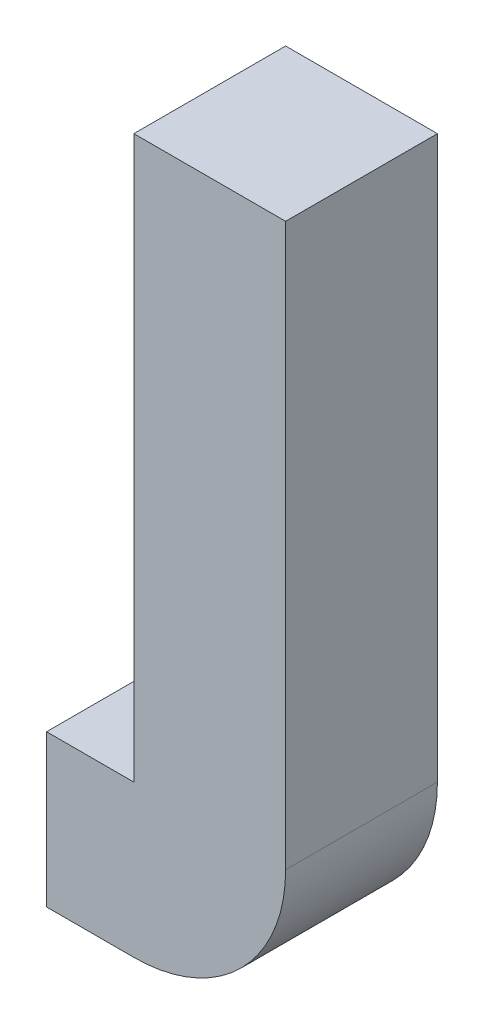
ISO-10303-21;
HEADER;
FILE_DESCRIPTION(('STEP AP214'),'2;1');
FILE_NAME('part.step','',(''),(''),'','','');
FILE_SCHEMA(('AUTOMOTIVE_DESIGN { 1 0 10303 214 1 1 1 1 }'));
ENDSEC;
DATA;
#1=APPLICATION_CONTEXT('core data for automotive mechanical design processes');
#2=APPLICATION_PROTOCOL_DEFINITION('international standard','automotive_design',2000,#1);
#3=PRODUCT_CONTEXT('',#1,'mechanical');
#4=PRODUCT('Part','Part','',(#3));
#5=PRODUCT_RELATED_PRODUCT_CATEGORY('part','',(#4));
#6=PRODUCT_DEFINITION_FORMATION('','',#4);
#7=PRODUCT_DEFINITION_CONTEXT('part definition',#1,'design');
#8=PRODUCT_DEFINITION('design','',#6,#7);
#9=PRODUCT_DEFINITION_SHAPE('','',#8);
#10=(LENGTH_UNIT() NAMED_UNIT(*) SI_UNIT(.MILLI.,.METRE.));
#11=(NAMED_UNIT(*) PLANE_ANGLE_UNIT() SI_UNIT($,.RADIAN.));
#12=(NAMED_UNIT(*) SI_UNIT($,.STERADIAN.) SOLID_ANGLE_UNIT());
#13=UNCERTAINTY_MEASURE_WITH_UNIT(LENGTH_MEASURE(1.E-05),#10,'distance_accuracy_value','');
#14=(GEOMETRIC_REPRESENTATION_CONTEXT(3) GLOBAL_UNCERTAINTY_ASSIGNED_CONTEXT((#13)) GLOBAL_UNIT_ASSIGNED_CONTEXT((#10,
#11,#12)) REPRESENTATION_CONTEXT('',''));
#15=CARTESIAN_POINT('',(0.,0.,0.));
#16=DIRECTION('',(0.,0.,1.));
#17=DIRECTION('',(1.,0.,0.));
#18=AXIS2_PLACEMENT_3D('',#15,#16,#17);
#19=CARTESIAN_POINT('',(60.,38.1,0.));
#20=DIRECTION('',(1.,0.,0.));
#21=DIRECTION('',(0.,1.,0.));
#22=AXIS2_PLACEMENT_3D('',#19,#20,#21);
#23=PLANE('',#22);
#24=DIRECTION('',(0.,0.,-1.));
#25=VECTOR('',#24,1.);
#26=CARTESIAN_POINT('',(60.,38.1,0.));
#27=LINE('',#26,#25);
#28=CARTESIAN_POINT('',(60.,38.1,0.));
#29=VERTEX_POINT('',#28);
#30=CARTESIAN_POINT('',(60.,38.1,-38.1));
#31=VERTEX_POINT('',#30);
#32=EDGE_CURVE('E106',#29,#31,#27,.T.);
#33=ORIENTED_EDGE('',*,*,#32,.T.);
#34=DIRECTION('',(0.,1.,0.));
#35=VECTOR('',#34,1.);
#36=CARTESIAN_POINT('',(60.,38.1,-38.1));
#37=LINE('',#36,#35);
#38=CARTESIAN_POINT('',(60.,179.05,-38.1));
#39=VERTEX_POINT('',#38);
#40=EDGE_CURVE('E46',#31,#39,#37,.T.);
#41=ORIENTED_EDGE('',*,*,#40,.T.);
#42=DIRECTION('',(0.,0.,-1.));
#43=VECTOR('',#42,1.);
#44=CARTESIAN_POINT('',(60.,179.05,0.));
#45=LINE('',#44,#43);
#46=CARTESIAN_POINT('',(60.,179.05,0.));
#47=VERTEX_POINT('',#46);
#48=EDGE_CURVE('E53',#47,#39,#45,.T.);
#49=ORIENTED_EDGE('',*,*,#48,.F.);
#50=DIRECTION('',(0.,1.,0.));
#51=VECTOR('',#50,1.);
#52=CARTESIAN_POINT('',(60.,38.1,0.));
#53=LINE('',#52,#51);
#54=EDGE_CURVE('E11',#29,#47,#53,.T.);
#55=ORIENTED_EDGE('',*,*,#54,.F.);
#56=EDGE_LOOP('',(#33,#41,#49,#55));
#57=FACE_BOUND('',#56,.T.);
#58=ADVANCED_FACE('F39',(#57),#23,.T.);
#59=CARTESIAN_POINT('',(21.9,38.1,0.));
#60=DIRECTION('',(-1.,0.,0.));
#61=DIRECTION('',(0.,-1.,0.));
#62=AXIS2_PLACEMENT_3D('',#59,#60,#61);
#63=PLANE('',#62);
#64=DIRECTION('',(0.,0.,1.));
#65=VECTOR('',#64,1.);
#66=CARTESIAN_POINT('',(21.9,38.1,0.));
#67=LINE('',#66,#65);
#68=CARTESIAN_POINT('',(21.9,38.1,-38.1));
#69=VERTEX_POINT('',#68);
#70=CARTESIAN_POINT('',(21.9,38.1,0.));
#71=VERTEX_POINT('',#70);
#72=EDGE_CURVE('E119',#69,#71,#67,.T.);
#73=ORIENTED_EDGE('',*,*,#72,.T.);
#74=DIRECTION('',(0.,1.,0.));
#75=VECTOR('',#74,1.);
#76=CARTESIAN_POINT('',(21.9,38.1,0.));
#77=LINE('',#76,#75);
#78=CARTESIAN_POINT('',(21.9,179.05,0.));
#79=VERTEX_POINT('',#78);
#80=EDGE_CURVE('E139',#71,#79,#77,.T.);
#81=ORIENTED_EDGE('',*,*,#80,.T.);
#82=DIRECTION('',(0.,0.,1.));
#83=VECTOR('',#82,1.);
#84=CARTESIAN_POINT('',(21.9,179.05,0.));
#85=LINE('',#84,#83);
#86=CARTESIAN_POINT('',(21.9,179.05,-38.1));
#87=VERTEX_POINT('',#86);
#88=EDGE_CURVE('E134',#87,#79,#85,.T.);
#89=ORIENTED_EDGE('',*,*,#88,.F.);
#90=DIRECTION('',(0.,1.,0.));
#91=VECTOR('',#90,1.);
#92=CARTESIAN_POINT('',(21.9,38.1,-38.1));
#93=LINE('',#92,#91);
#94=EDGE_CURVE('E142',#69,#87,#93,.T.);
#95=ORIENTED_EDGE('',*,*,#94,.F.);
#96=EDGE_LOOP('',(#73,#81,#89,#95));
#97=FACE_BOUND('',#96,.T.);
#98=ADVANCED_FACE('F164',(#97),#63,.T.);
#99=CARTESIAN_POINT('',(21.9,38.1,0.));
#100=DIRECTION('',(0.,0.,1.));
#101=DIRECTION('',(1.,0.,0.));
#102=AXIS2_PLACEMENT_3D('',#99,#100,#101);
#103=CYLINDRICAL_SURFACE('',#102,38.1);
#104=DIRECTION('',(0.,0.,-1.));
#105=VECTOR('',#104,1.);
#106=CARTESIAN_POINT('',(21.9,0.,0.));
#107=LINE('',#106,#105);
#108=CARTESIAN_POINT('',(21.9,0.,0.));
#109=VERTEX_POINT('',#108);
#110=CARTESIAN_POINT('',(21.9,0.,-38.1));
#111=VERTEX_POINT('',#110);
#112=EDGE_CURVE('E103',#109,#111,#107,.T.);
#113=ORIENTED_EDGE('',*,*,#112,.T.);
#114=CARTESIAN_POINT('',(21.9,38.1,-38.1));
#115=DIRECTION('',(0.,0.,1.));
#116=DIRECTION('',(1.,0.,0.));
#117=AXIS2_PLACEMENT_3D('',#114,#115,#116);
#118=CIRCLE('',#117,38.1);
#119=EDGE_CURVE('E110',#111,#31,#118,.T.);
#120=ORIENTED_EDGE('',*,*,#119,.T.);
#121=ORIENTED_EDGE('',*,*,#32,.F.);
#122=CARTESIAN_POINT('',(21.9,38.1,0.));
#123=DIRECTION('',(0.,0.,1.));
#124=DIRECTION('',(1.,0.,0.));
#125=AXIS2_PLACEMENT_3D('',#122,#123,#124);
#126=CIRCLE('',#125,38.1);
#127=EDGE_CURVE('E99',#109,#29,#126,.T.);
#128=ORIENTED_EDGE('',*,*,#127,.F.);
#129=EDGE_LOOP('',(#113,#120,#121,#128));
#130=FACE_BOUND('',#129,.T.);
#131=ADVANCED_FACE('F101',(#130),#103,.T.);
#132=CARTESIAN_POINT('',(21.9,0.,0.));
#133=DIRECTION('',(0.,0.,-1.));
#134=DIRECTION('',(-1.,0.,0.));
#135=AXIS2_PLACEMENT_3D('',#132,#133,#134);
#136=PLANE('',#135);
#137=DIRECTION('',(0.,-1.,0.));
#138=VECTOR('',#137,1.);
#139=CARTESIAN_POINT('',(0.,0.,0.));
#140=LINE('',#139,#138);
#141=CARTESIAN_POINT('',(0.,38.1,0.));
#142=VERTEX_POINT('',#141);
#143=CARTESIAN_POINT('',(0.,0.,0.));
#144=VERTEX_POINT('',#143);
#145=EDGE_CURVE('E125',#142,#144,#140,.T.);
#146=ORIENTED_EDGE('',*,*,#145,.T.);
#147=DIRECTION('',(-1.,0.,0.));
#148=VECTOR('',#147,1.);
#149=CARTESIAN_POINT('',(21.9,0.,0.));
#150=LINE('',#149,#148);
#151=EDGE_CURVE('E115',#109,#144,#150,.T.);
#152=ORIENTED_EDGE('',*,*,#151,.F.);
#153=ORIENTED_EDGE('',*,*,#127,.T.);
#154=ORIENTED_EDGE('',*,*,#54,.T.);
#155=DIRECTION('',(1.,0.,0.));
#156=VECTOR('',#155,1.);
#157=CARTESIAN_POINT('',(60.,179.05,0.));
#158=LINE('',#157,#156);
#159=EDGE_CURVE('E109',#79,#47,#158,.T.);
#160=ORIENTED_EDGE('',*,*,#159,.F.);
#161=ORIENTED_EDGE('',*,*,#80,.F.);
#162=DIRECTION('',(-1.,0.,0.));
#163=VECTOR('',#162,1.);
#164=CARTESIAN_POINT('',(21.9,38.1,0.));
#165=LINE('',#164,#163);
#166=EDGE_CURVE('E157',#71,#142,#165,.T.);
#167=ORIENTED_EDGE('',*,*,#166,.T.);
#168=EDGE_LOOP('',(#146,#152,#153,#154,#160,#161,#167));
#169=FACE_BOUND('',#168,.T.);
#170=ADVANCED_FACE('F122',(#169),#136,.F.);
#171=CARTESIAN_POINT('',(21.9,0.,0.));
#172=DIRECTION('',(0.,1.,0.));
#173=DIRECTION('',(0.,0.,1.));
#174=AXIS2_PLACEMENT_3D('',#171,#172,#173);
#175=PLANE('',#174);
#176=DIRECTION('',(0.,0.,-1.));
#177=VECTOR('',#176,1.);
#178=CARTESIAN_POINT('',(0.,0.,0.));
#179=LINE('',#178,#177);
#180=CARTESIAN_POINT('',(0.,0.,-38.1));
#181=VERTEX_POINT('',#180);
#182=EDGE_CURVE('E151',#144,#181,#179,.T.);
#183=ORIENTED_EDGE('',*,*,#182,.T.);
#184=DIRECTION('',(-1.,0.,0.));
#185=VECTOR('',#184,1.);
#186=CARTESIAN_POINT('',(21.9,0.,-38.1));
#187=LINE('',#186,#185);
#188=EDGE_CURVE('E118',#111,#181,#187,.T.);
#189=ORIENTED_EDGE('',*,*,#188,.F.);
#190=ORIENTED_EDGE('',*,*,#112,.F.);
#191=ORIENTED_EDGE('',*,*,#151,.T.);
#192=EDGE_LOOP('',(#183,#189,#190,#191));
#193=FACE_BOUND('',#192,.T.);
#194=ADVANCED_FACE('F114',(#193),#175,.F.);
#195=CARTESIAN_POINT('',(21.9,0.,-38.1));
#196=DIRECTION('',(0.,0.,1.));
#197=DIRECTION('',(1.,0.,0.));
#198=AXIS2_PLACEMENT_3D('',#195,#196,#197);
#199=PLANE('',#198);
#200=DIRECTION('',(0.,1.,0.));
#201=VECTOR('',#200,1.);
#202=CARTESIAN_POINT('',(0.,0.,-38.1));
#203=LINE('',#202,#201);
#204=CARTESIAN_POINT('',(0.,38.1,-38.1));
#205=VERTEX_POINT('',#204);
#206=EDGE_CURVE('E146',#181,#205,#203,.T.);
#207=ORIENTED_EDGE('',*,*,#206,.T.);
#208=DIRECTION('',(-1.,0.,0.));
#209=VECTOR('',#208,1.);
#210=CARTESIAN_POINT('',(21.9,38.1,-38.1));
#211=LINE('',#210,#209);
#212=EDGE_CURVE('E128',#69,#205,#211,.T.);
#213=ORIENTED_EDGE('',*,*,#212,.F.);
#214=ORIENTED_EDGE('',*,*,#94,.T.);
#215=DIRECTION('',(-1.,0.,0.));
#216=VECTOR('',#215,1.);
#217=CARTESIAN_POINT('',(60.,179.05,-38.1));
#218=LINE('',#217,#216);
#219=EDGE_CURVE('E61',#39,#87,#218,.T.);
#220=ORIENTED_EDGE('',*,*,#219,.F.);
#221=ORIENTED_EDGE('',*,*,#40,.F.);
#222=ORIENTED_EDGE('',*,*,#119,.F.);
#223=ORIENTED_EDGE('',*,*,#188,.T.);
#224=EDGE_LOOP('',(#207,#213,#214,#220,#221,#222,#223));
#225=FACE_BOUND('',#224,.T.);
#226=ADVANCED_FACE('F143',(#225),#199,.F.);
#227=CARTESIAN_POINT('',(21.9,38.1,0.));
#228=DIRECTION('',(0.,-1.,0.));
#229=DIRECTION('',(0.,0.,-1.));
#230=AXIS2_PLACEMENT_3D('',#227,#228,#229);
#231=PLANE('',#230);
#232=DIRECTION('',(0.,0.,1.));
#233=VECTOR('',#232,1.);
#234=CARTESIAN_POINT('',(0.,38.1,0.));
#235=LINE('',#234,#233);
#236=EDGE_CURVE('E120',#205,#142,#235,.T.);
#237=ORIENTED_EDGE('',*,*,#236,.T.);
#238=ORIENTED_EDGE('',*,*,#166,.F.);
#239=ORIENTED_EDGE('',*,*,#72,.F.);
#240=ORIENTED_EDGE('',*,*,#212,.T.);
#241=EDGE_LOOP('',(#237,#238,#239,#240));
#242=FACE_BOUND('',#241,.T.);
#243=ADVANCED_FACE('F160',(#242),#231,.F.);
#244=CARTESIAN_POINT('',(60.,179.05,0.));
#245=DIRECTION('',(0.,-1.,0.));
#246=DIRECTION('',(0.,0.,1.));
#247=AXIS2_PLACEMENT_3D('',#244,#245,#246);
#248=PLANE('',#247);
#249=ORIENTED_EDGE('',*,*,#159,.T.);
#250=ORIENTED_EDGE('',*,*,#48,.T.);
#251=ORIENTED_EDGE('',*,*,#219,.T.);
#252=ORIENTED_EDGE('',*,*,#88,.T.);
#253=EDGE_LOOP('',(#249,#250,#251,#252));
#254=FACE_BOUND('',#253,.T.);
#255=ADVANCED_FACE('F166',(#254),#248,.F.);
#256=CARTESIAN_POINT('',(0.,0.,0.));
#257=DIRECTION('',(-1.,0.,0.));
#258=DIRECTION('',(0.,0.,1.));
#259=AXIS2_PLACEMENT_3D('',#256,#257,#258);
#260=PLANE('',#259);
#261=ORIENTED_EDGE('',*,*,#145,.F.);
#262=ORIENTED_EDGE('',*,*,#236,.F.);
#263=ORIENTED_EDGE('',*,*,#206,.F.);
#264=ORIENTED_EDGE('',*,*,#182,.F.);
#265=EDGE_LOOP('',(#261,#262,#263,#264));
#266=FACE_BOUND('',#265,.T.);
#267=ADVANCED_FACE('F150',(#266),#260,.T.);
#268=CLOSED_SHELL('',(#58,#98,#131,#170,#194,#226,#243,#255,#267));
#269=MANIFOLD_SOLID_BREP('B2',#268);
#270=ADVANCED_BREP_SHAPE_REPRESENTATION('',(#18,#269),#14);
#271=SHAPE_DEFINITION_REPRESENTATION(#9,#270);
ENDSEC;
END-ISO-10303-21;
